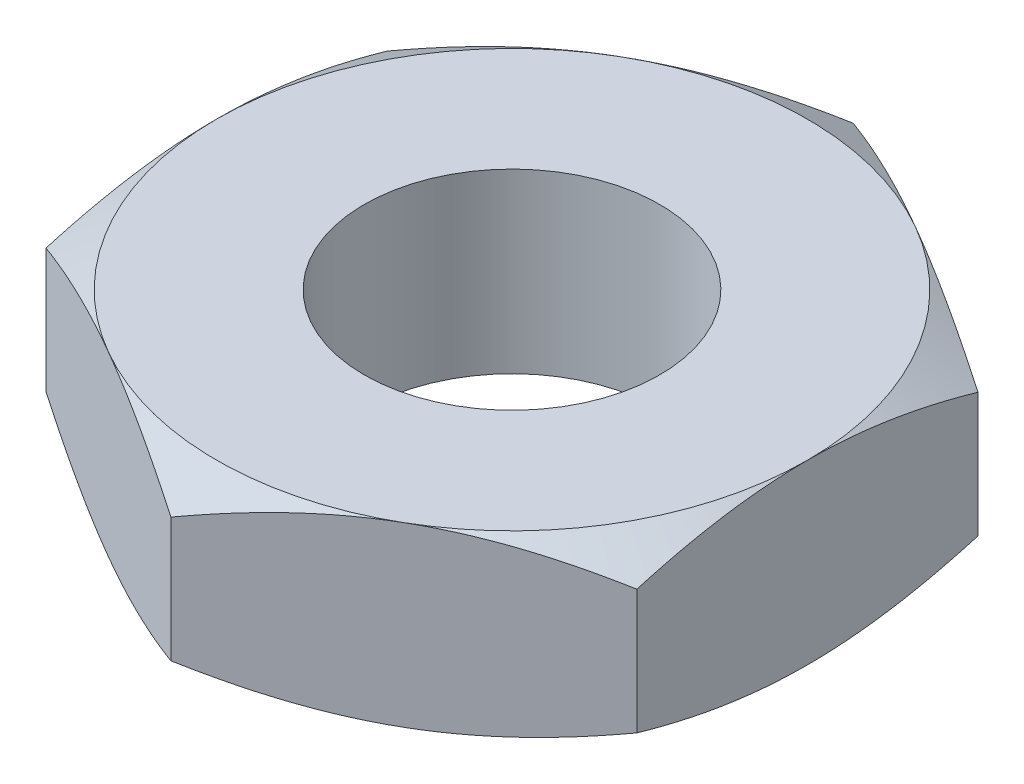
ISO-10303-21;
HEADER;
FILE_DESCRIPTION(('STEP AP214'),'2;1');
FILE_NAME('part.step','',(''),(''),'','','');
FILE_SCHEMA(('AUTOMOTIVE_DESIGN { 1 0 10303 214 1 1 1 1 }'));
ENDSEC;
DATA;
#1=APPLICATION_CONTEXT('core data for automotive mechanical design processes');
#2=APPLICATION_PROTOCOL_DEFINITION('international standard','automotive_design',2000,#1);
#3=PRODUCT_CONTEXT('',#1,'mechanical');
#4=PRODUCT('Part','Part','',(#3));
#5=PRODUCT_RELATED_PRODUCT_CATEGORY('part','',(#4));
#6=PRODUCT_DEFINITION_FORMATION('','',#4);
#7=PRODUCT_DEFINITION_CONTEXT('part definition',#1,'design');
#8=PRODUCT_DEFINITION('design','',#6,#7);
#9=PRODUCT_DEFINITION_SHAPE('','',#8);
#10=(LENGTH_UNIT() NAMED_UNIT(*) SI_UNIT(.MILLI.,.METRE.));
#11=(NAMED_UNIT(*) PLANE_ANGLE_UNIT() SI_UNIT($,.RADIAN.));
#12=(NAMED_UNIT(*) SI_UNIT($,.STERADIAN.) SOLID_ANGLE_UNIT());
#13=UNCERTAINTY_MEASURE_WITH_UNIT(LENGTH_MEASURE(1.E-05),#10,'distance_accuracy_value','');
#14=(GEOMETRIC_REPRESENTATION_CONTEXT(3) GLOBAL_UNCERTAINTY_ASSIGNED_CONTEXT((#13)) GLOBAL_UNIT_ASSIGNED_CONTEXT((#10,
#11,#12)) REPRESENTATION_CONTEXT('',''));
#15=CARTESIAN_POINT('',(0.,0.,0.));
#16=DIRECTION('',(0.,0.,1.));
#17=DIRECTION('',(1.,0.,0.));
#18=AXIS2_PLACEMENT_3D('',#15,#16,#17);
#19=CARTESIAN_POINT('',(-2.,0.6,-1.15470053837925));
#20=DIRECTION('',(0.,1.,0.));
#21=DIRECTION('',(0.,0.,1.));
#22=AXIS2_PLACEMENT_3D('',#19,#20,#21);
#23=PLANE('',#22);
#24=CARTESIAN_POINT('',(0.,0.6,0.));
#25=DIRECTION('',(0.,1.,0.));
#26=DIRECTION('',(0.,0.,1.));
#27=AXIS2_PLACEMENT_3D('',#24,#25,#26);
#28=CIRCLE('',#27,1.);
#29=CARTESIAN_POINT('',(0.,0.6,1.));
#30=VERTEX_POINT('',#29);
#31=EDGE_CURVE('E243',#30,#30,#28,.T.);
#32=ORIENTED_EDGE('',*,*,#31,.F.);
#33=EDGE_LOOP('',(#32));
#34=FACE_BOUND('',#33,.T.);
#35=CARTESIAN_POINT('',(0.,0.6,0.));
#36=DIRECTION('',(0.,1.,0.));
#37=DIRECTION('',(0.,0.,1.));
#38=AXIS2_PLACEMENT_3D('',#35,#36,#37);
#39=CIRCLE('',#38,2.);
#40=CARTESIAN_POINT('',(-1.,0.6,1.73205080756888));
#41=VERTEX_POINT('',#40);
#42=CARTESIAN_POINT('',(1.,0.6,1.73205080756888));
#43=VERTEX_POINT('',#42);
#44=EDGE_CURVE('E302',#41,#43,#39,.T.);
#45=ORIENTED_EDGE('',*,*,#44,.T.);
#46=CARTESIAN_POINT('',(2.,0.6,0.));
#47=VERTEX_POINT('',#46);
#48=EDGE_CURVE('E305',#43,#47,#39,.T.);
#49=ORIENTED_EDGE('',*,*,#48,.T.);
#50=CARTESIAN_POINT('',(1.,0.6,-1.73205080756888));
#51=VERTEX_POINT('',#50);
#52=EDGE_CURVE('E312',#47,#51,#39,.T.);
#53=ORIENTED_EDGE('',*,*,#52,.T.);
#54=CARTESIAN_POINT('',(-1.,0.6,-1.73205080756888));
#55=VERTEX_POINT('',#54);
#56=EDGE_CURVE('E316',#51,#55,#39,.T.);
#57=ORIENTED_EDGE('',*,*,#56,.T.);
#58=CARTESIAN_POINT('',(-2.,0.6,0.));
#59=VERTEX_POINT('',#58);
#60=EDGE_CURVE('E309',#55,#59,#39,.T.);
#61=ORIENTED_EDGE('',*,*,#60,.T.);
#62=EDGE_CURVE('E304',#59,#41,#39,.T.);
#63=ORIENTED_EDGE('',*,*,#62,.T.);
#64=EDGE_LOOP('',(#45,#49,#53,#57,#61,#63));
#65=FACE_BOUND('',#64,.T.);
#66=ADVANCED_FACE('F39',(#34,#65),#23,.T.);
#67=CARTESIAN_POINT('',(0.,0.6,-2.3094010767585));
#68=DIRECTION('',(0.5,0.,0.866025403784439));
#69=DIRECTION('',(0.866025403784439,0.,-0.5));
#70=AXIS2_PLACEMENT_3D('',#67,#68,#69);
#71=PLANE('',#70);
#72=DIRECTION('',(0.,-1.,0.));
#73=VECTOR('',#72,1.);
#74=CARTESIAN_POINT('',(0.,0.6,-2.3094010767585));
#75=LINE('',#74,#73);
#76=CARTESIAN_POINT('',(0.,0.421367205045919,-2.3094010767585));
#77=VERTEX_POINT('',#76);
#78=CARTESIAN_POINT('',(0.,-0.421367205045919,-2.3094010767585));
#79=VERTEX_POINT('',#78);
#80=EDGE_CURVE('E240',#77,#79,#75,.T.);
#81=ORIENTED_EDGE('',*,*,#80,.T.);
#82=CARTESIAN_POINT('',(0.000200000000000439,-0.421300533379502,-2.30951654681234));
#83=CARTESIAN_POINT('',(-0.0876912629000594,-0.450610463899321,-2.25877250251758));
#84=CARTESIAN_POINT('',(-0.176341194473591,-0.477267148019533,-2.20759044065996));
#85=CARTESIAN_POINT('',(-0.355176246997801,-0.523797508979279,-2.10433997494456));
#86=CARTESIAN_POINT('',(-0.445364546505036,-0.54365472361722,-2.05226973594631));
#87=CARTESIAN_POINT('',(-0.624623385763305,-0.574566535976747,-1.94877459684592));
#88=CARTESIAN_POINT('',(-0.713666338226303,-0.585826848401469,-1.89736562427197));
#89=CARTESIAN_POINT('',(-0.892171397785043,-0.599271337405358,-1.79430568008402));
#90=CARTESIAN_POINT('',(-0.981632855703958,-0.601466645046532,-1.74265508327244));
#91=CARTESIAN_POINT('',(-1.1488083535488,-0.596909010669351,-1.64613626458981));
#92=CARTESIAN_POINT('',(-1.22654737026578,-0.591275125312985,-1.60125362236173));
#93=CARTESIAN_POINT('',(-1.38151891453613,-0.573416104739172,-1.51178075956051));
#94=CARTESIAN_POINT('',(-1.4587509057412,-0.561184863976561,-1.46719084864821));
#95=CARTESIAN_POINT('',(-1.6140421864822,-0.53060656313239,-1.37753338590959));
#96=CARTESIAN_POINT('',(-1.69208181310738,-0.512129832934284,-1.33247718647009));
#97=CARTESIAN_POINT('',(-1.84699686569214,-0.470194481787144,-1.24303693915875));
#98=CARTESIAN_POINT('',(-1.92387427762312,-0.446745719507687,-1.1986517446858));
#99=CARTESIAN_POINT('',(-2.0002,-0.421300533379502,-1.15458506832541));
#100=B_SPLINE_CURVE_WITH_KNOTS('',3,(#82,#83,#84,#85,#86,#87,#88,#89,#90,#91,#92,#93,#94,#95,
#96,#97,#98,#99),.UNSPECIFIED.,.F.,.F.,(4,2,2,2,2,2,2,2,4),(0.,0.31703182469561,
0.634825876346563,0.944753967652636,1.25430138000371,1.52387047293094,1.79368946861028,
2.06949491027634,2.34475850821473),.UNSPECIFIED.);
#101=CARTESIAN_POINT('',(-1.,-0.6,-1.73205080756888));
#102=VERTEX_POINT('',#101);
#103=EDGE_CURVE('E62',#79,#102,#100,.T.);
#104=ORIENTED_EDGE('',*,*,#103,.T.);
#105=CARTESIAN_POINT('',(-2.,-0.421367205046049,-1.15470053837945));
#106=VERTEX_POINT('',#105);
#107=EDGE_CURVE('E198',#102,#106,#100,.T.);
#108=ORIENTED_EDGE('',*,*,#107,.T.);
#109=DIRECTION('',(0.,-1.,0.));
#110=VECTOR('',#109,1.);
#111=CARTESIAN_POINT('',(-2.,0.6,-1.15470053837925));
#112=LINE('',#111,#110);
#113=CARTESIAN_POINT('',(-2.,0.421367205046049,-1.15470053837945));
#114=VERTEX_POINT('',#113);
#115=EDGE_CURVE('E228',#114,#106,#112,.T.);
#116=ORIENTED_EDGE('',*,*,#115,.F.);
#117=CARTESIAN_POINT('',(0.000200000000000439,0.421300533379502,-2.30951654681234));
#118=CARTESIAN_POINT('',(-0.0876912629000594,0.450610463899321,-2.25877250251758));
#119=CARTESIAN_POINT('',(-0.176341194473591,0.477267148019533,-2.20759044065996));
#120=CARTESIAN_POINT('',(-0.355176246997801,0.523797508979279,-2.10433997494456));
#121=CARTESIAN_POINT('',(-0.445364546505036,0.54365472361722,-2.05226973594631));
#122=CARTESIAN_POINT('',(-0.624623385763305,0.574566535976747,-1.94877459684592));
#123=CARTESIAN_POINT('',(-0.713666338226303,0.585826848401469,-1.89736562427197));
#124=CARTESIAN_POINT('',(-0.892171397785043,0.599271337405358,-1.79430568008402));
#125=CARTESIAN_POINT('',(-0.981632855703958,0.601466645046532,-1.74265508327244));
#126=CARTESIAN_POINT('',(-1.1488083535488,0.596909010669351,-1.64613626458981));
#127=CARTESIAN_POINT('',(-1.22654737026578,0.591275125312985,-1.60125362236173));
#128=CARTESIAN_POINT('',(-1.38151891453613,0.573416104739172,-1.51178075956051));
#129=CARTESIAN_POINT('',(-1.4587509057412,0.561184863976561,-1.46719084864821));
#130=CARTESIAN_POINT('',(-1.6140421864822,0.53060656313239,-1.37753338590959));
#131=CARTESIAN_POINT('',(-1.69208181310738,0.512129832934284,-1.33247718647009));
#132=CARTESIAN_POINT('',(-1.84699686569214,0.470194481787144,-1.24303693915875));
#133=CARTESIAN_POINT('',(-1.92387427762312,0.446745719507687,-1.1986517446858));
#134=CARTESIAN_POINT('',(-2.0002,0.421300533379502,-1.15458506832541));
#135=B_SPLINE_CURVE_WITH_KNOTS('',3,(#117,#118,#119,#120,#121,#122,#123,#124,#125,#126,#127,
#128,#129,#130,#131,#132,#133,#134),.UNSPECIFIED.,.F.,.F.,(4,2,2,2,2,2,2,2,4),(0.,
0.31703182469561,0.634825876346563,0.944753967652636,1.25430138000371,1.52387047293094,
1.79368946861028,2.06949491027634,2.34475850821473),.UNSPECIFIED.);
#136=EDGE_CURVE('E250',#55,#114,#135,.T.);
#137=ORIENTED_EDGE('',*,*,#136,.F.);
#138=EDGE_CURVE('E247',#77,#55,#135,.T.);
#139=ORIENTED_EDGE('',*,*,#138,.F.);
#140=EDGE_LOOP('',(#81,#104,#108,#116,#137,#139));
#141=FACE_BOUND('',#140,.T.);
#142=ADVANCED_FACE('F41',(#141),#71,.F.);
#143=CARTESIAN_POINT('',(-2.,0.6,-1.15470053837925));
#144=DIRECTION('',(1.,0.,0.));
#145=DIRECTION('',(0.,0.,-1.));
#146=AXIS2_PLACEMENT_3D('',#143,#144,#145);
#147=PLANE('',#146);
#148=ORIENTED_EDGE('',*,*,#115,.T.);
#149=CARTESIAN_POINT('',(-2.,0.38557288901344,-3.12126753611571));
#150=CARTESIAN_POINT('',(-2.,0.343033819884847,-3.03373603253382));
#151=CARTESIAN_POINT('',(-2.,0.300897046350178,-2.94600566264244));
#152=CARTESIAN_POINT('',(-2.,0.217654002804882,-2.77004148551632));
#153=CARTESIAN_POINT('',(-2.,0.176547891526083,-2.68180760327354));
#154=CARTESIAN_POINT('',(-2.,0.0953895262527858,-2.50428557296446));
#155=CARTESIAN_POINT('',(-2.,0.0553440575414027,-2.41499431225501));
#156=CARTESIAN_POINT('',(-2.,-0.0231336996934489,-2.23570828641359));
#157=CARTESIAN_POINT('',(-2.,-0.0615660632000194,-2.14571355421277));
#158=CARTESIAN_POINT('',(-2.,-0.137618637341878,-1.9619137188298));
#159=CARTESIAN_POINT('',(-2.,-0.175170980395035,-1.86808038132573));
#160=CARTESIAN_POINT('',(-2.,-0.247473123064834,-1.67934204020328));
#161=CARTESIAN_POINT('',(-2.,-0.282223173005209,-1.58443713317158));
#162=CARTESIAN_POINT('',(-2.,-0.348034806312006,-1.39354791499266));
#163=CARTESIAN_POINT('',(-2.,-0.379103328069959,-1.29756601992183));
#164=CARTESIAN_POINT('',(-2.,-0.43656407784701,-1.10422565950118));
#165=CARTESIAN_POINT('',(-2.,-0.46295775755574,-1.00686763166145));
#166=CARTESIAN_POINT('',(-2.,-0.509676701821438,-0.811250894587943));
#167=CARTESIAN_POINT('',(-2.,-0.530034820909343,-0.713000178827866));
#168=CARTESIAN_POINT('',(-2.,-0.563542227148979,-0.51525761994497));
#169=CARTESIAN_POINT('',(-2.,-0.576692254149941,-0.415765905272652));
#170=CARTESIAN_POINT('',(-2.,-0.594559696893259,-0.217342464958799));
#171=CARTESIAN_POINT('',(-2.,-0.599387104142226,-0.118420932899998));
#172=CARTESIAN_POINT('',(-2.,-0.600503396452733,0.0794683361571467));
#173=CARTESIAN_POINT('',(-2.,-0.596792096656169,0.178436074109446));
#174=CARTESIAN_POINT('',(-2.,-0.578063778540289,0.414659658925583));
#175=CARTESIAN_POINT('',(-2.,-0.559162586891577,0.551609910573144));
#176=CARTESIAN_POINT('',(-2.,-0.508265075021401,0.823054674007726));
#177=CARTESIAN_POINT('',(-2.,-0.476256473923137,0.957546758850365));
#178=CARTESIAN_POINT('',(-2.,-0.401810126353593,1.22689179635191));
#179=CARTESIAN_POINT('',(-2.,-0.359148525475946,1.36168130483449));
#180=CARTESIAN_POINT('',(-2.,-0.28989757673053,1.56197975811112));
#181=CARTESIAN_POINT('',(-2.,-0.265939877951343,1.62842575511412));
#182=CARTESIAN_POINT('',(-2.,-0.216547213808057,1.76076659969631));
#183=CARTESIAN_POINT('',(-2.,-0.191112276924237,1.82666145787312));
#184=CARTESIAN_POINT('',(-2.,-0.123211373557019,1.99778681182454));
#185=CARTESIAN_POINT('',(-2.,-0.0797737383910382,2.10263074104482));
#186=CARTESIAN_POINT('',(-2.,0.00949834214268721,2.31129680003625));
#187=CARTESIAN_POINT('',(-2.,0.0553330034415304,2.41511883674791));
#188=CARTESIAN_POINT('',(-2.,0.148852476124769,2.62196120377702));
#189=CARTESIAN_POINT('',(-2.,0.196537840400779,2.72498128330376));
#190=CARTESIAN_POINT('',(-2.,0.29334179704414,2.93034706192578));
#191=CARTESIAN_POINT('',(-2.,0.342460428478685,3.03269274254529));
#192=CARTESIAN_POINT('',(-2.,0.49163439526772,3.33919760122935));
#193=CARTESIAN_POINT('',(-2.,0.593374943951518,3.54253566503882));
#194=CARTESIAN_POINT('',(-2.,0.79972473458573,3.94769403743467));
#195=CARTESIAN_POINT('',(-2.,0.904333459413751,4.14951461136634));
#196=CARTESIAN_POINT('',(-2.,1.10503354746327,4.5321025708419));
#197=CARTESIAN_POINT('',(-2.,1.20093777929948,4.71296829565948));
#198=CARTESIAN_POINT('',(-2.,1.39392970686111,5.07407845318899));
#199=CARTESIAN_POINT('',(-2.,1.49101746477198,5.25432285261106));
#200=CARTESIAN_POINT('',(-2.,1.68577789266207,5.61378039618828));
#201=CARTESIAN_POINT('',(-2.,1.78344785740034,5.79299500785806));
#202=CARTESIAN_POINT('',(-2.,1.97946951859646,6.15103475800708));
#203=CARTESIAN_POINT('',(-2.,2.07782116654584,6.329859923033));
#204=CARTESIAN_POINT('',(-2.,2.17642218980802,6.50854651302516));
#205=B_SPLINE_CURVE_WITH_KNOTS('',3,(#149,#150,#151,#152,#153,#154,#155,#156,#157,#158,#159,
#160,#161,#162,#163,#164,#165,#166,#167,#168,#169,#170,#171,#172,#173,#174,#175,#176,#177,#178,
#179,#180,#181,#182,#183,#184,#185,#186,#187,#188,#189,#190,#191,#192,#193,#194,#195,#196,#197,
#198,#199,#200,#201,#202,#203,#204),.UNSPECIFIED.,.F.,.F.,(4,2,2,2,2,2,2,2,2,2,2,2,2,2,2,2,2,2,
2,2,2,2,2,2,2,2,2,4),(0.,0.291965851079035,0.583976394873748,0.87754344183723,1.17109682757052,
1.47426835892393,1.77741277844896,2.07997647055767,2.3824460414974,2.68323754429508,
2.98399816762419,3.28075257631837,3.57751340963554,3.99140512508845,4.40568552342073,
4.82953678291614,5.04142455310282,5.2533082395735,5.59372400200991,5.9341704830902,
6.27471946641354,6.61527774091709,7.29734808574271,7.9792962539459,8.59344848602913,
9.20763312750973,9.81993507383114,10.4321938872487),.UNSPECIFIED.);
#206=CARTESIAN_POINT('',(-2.,-0.6,0.));
#207=VERTEX_POINT('',#206);
#208=EDGE_CURVE('E283',#106,#207,#205,.T.);
#209=ORIENTED_EDGE('',*,*,#208,.T.);
#210=CARTESIAN_POINT('',(-2.,-0.42136720504592,1.15470053837925));
#211=VERTEX_POINT('',#210);
#212=EDGE_CURVE('E277',#207,#211,#205,.T.);
#213=ORIENTED_EDGE('',*,*,#212,.T.);
#214=DIRECTION('',(0.,-1.,0.));
#215=VECTOR('',#214,1.);
#216=CARTESIAN_POINT('',(-2.,0.6,1.15470053837925));
#217=LINE('',#216,#215);
#218=CARTESIAN_POINT('',(-2.,0.42136720504592,1.15470053837925));
#219=VERTEX_POINT('',#218);
#220=EDGE_CURVE('E231',#219,#211,#217,.T.);
#221=ORIENTED_EDGE('',*,*,#220,.F.);
#222=CARTESIAN_POINT('',(-2.,-0.38557288901344,-3.12126753611571));
#223=CARTESIAN_POINT('',(-2.,-0.343033819884847,-3.03373603253382));
#224=CARTESIAN_POINT('',(-2.,-0.300897046350178,-2.94600566264244));
#225=CARTESIAN_POINT('',(-2.,-0.217654002804882,-2.77004148551632));
#226=CARTESIAN_POINT('',(-2.,-0.176547891526083,-2.68180760327354));
#227=CARTESIAN_POINT('',(-2.,-0.0953895262527858,-2.50428557296446));
#228=CARTESIAN_POINT('',(-2.,-0.0553440575414027,-2.41499431225501));
#229=CARTESIAN_POINT('',(-2.,0.0231336996934489,-2.23570828641359));
#230=CARTESIAN_POINT('',(-2.,0.0615660632000194,-2.14571355421277));
#231=CARTESIAN_POINT('',(-2.,0.137618637341878,-1.9619137188298));
#232=CARTESIAN_POINT('',(-2.,0.175170980395035,-1.86808038132573));
#233=CARTESIAN_POINT('',(-2.,0.247473123064834,-1.67934204020328));
#234=CARTESIAN_POINT('',(-2.,0.282223173005209,-1.58443713317158));
#235=CARTESIAN_POINT('',(-2.,0.348034806312006,-1.39354791499266));
#236=CARTESIAN_POINT('',(-2.,0.379103328069959,-1.29756601992183));
#237=CARTESIAN_POINT('',(-2.,0.43656407784701,-1.10422565950118));
#238=CARTESIAN_POINT('',(-2.,0.46295775755574,-1.00686763166145));
#239=CARTESIAN_POINT('',(-2.,0.509676701821438,-0.811250894587943));
#240=CARTESIAN_POINT('',(-2.,0.530034820909343,-0.713000178827866));
#241=CARTESIAN_POINT('',(-2.,0.563542227148979,-0.51525761994497));
#242=CARTESIAN_POINT('',(-2.,0.576692254149941,-0.415765905272652));
#243=CARTESIAN_POINT('',(-2.,0.594559696893259,-0.217342464958799));
#244=CARTESIAN_POINT('',(-2.,0.599387104142226,-0.118420932899998));
#245=CARTESIAN_POINT('',(-2.,0.600503396452733,0.0794683361571467));
#246=CARTESIAN_POINT('',(-2.,0.596792096656169,0.178436074109446));
#247=CARTESIAN_POINT('',(-2.,0.578063778540289,0.414659658925583));
#248=CARTESIAN_POINT('',(-2.,0.559162586891577,0.551609910573144));
#249=CARTESIAN_POINT('',(-2.,0.508265075021401,0.823054674007726));
#250=CARTESIAN_POINT('',(-2.,0.476256473923137,0.957546758850365));
#251=CARTESIAN_POINT('',(-2.,0.401810126353593,1.22689179635191));
#252=CARTESIAN_POINT('',(-2.,0.359148525475946,1.36168130483449));
#253=CARTESIAN_POINT('',(-2.,0.28989757673053,1.56197975811112));
#254=CARTESIAN_POINT('',(-2.,0.265939877951343,1.62842575511412));
#255=CARTESIAN_POINT('',(-2.,0.216547213808057,1.76076659969631));
#256=CARTESIAN_POINT('',(-2.,0.191112276924237,1.82666145787312));
#257=CARTESIAN_POINT('',(-2.,0.123211373557019,1.99778681182454));
#258=CARTESIAN_POINT('',(-2.,0.0797737383910382,2.10263074104482));
#259=CARTESIAN_POINT('',(-2.,-0.00949834214268721,2.31129680003625));
#260=CARTESIAN_POINT('',(-2.,-0.0553330034415304,2.41511883674791));
#261=CARTESIAN_POINT('',(-2.,-0.148852476124769,2.62196120377702));
#262=CARTESIAN_POINT('',(-2.,-0.196537840400779,2.72498128330376));
#263=CARTESIAN_POINT('',(-2.,-0.29334179704414,2.93034706192578));
#264=CARTESIAN_POINT('',(-2.,-0.342460428478685,3.03269274254529));
#265=CARTESIAN_POINT('',(-2.,-0.49163439526772,3.33919760122935));
#266=CARTESIAN_POINT('',(-2.,-0.593374943951518,3.54253566503882));
#267=CARTESIAN_POINT('',(-2.,-0.79972473458573,3.94769403743467));
#268=CARTESIAN_POINT('',(-2.,-0.904333459413751,4.14951461136634));
#269=CARTESIAN_POINT('',(-2.,-1.10503354746327,4.5321025708419));
#270=CARTESIAN_POINT('',(-2.,-1.20093777929948,4.71296829565948));
#271=CARTESIAN_POINT('',(-2.,-1.39392970686111,5.07407845318899));
#272=CARTESIAN_POINT('',(-2.,-1.49101746477198,5.25432285261106));
#273=CARTESIAN_POINT('',(-2.,-1.68577789266207,5.61378039618828));
#274=CARTESIAN_POINT('',(-2.,-1.78344785740034,5.79299500785806));
#275=CARTESIAN_POINT('',(-2.,-1.97946951859646,6.15103475800708));
#276=CARTESIAN_POINT('',(-2.,-2.07782116654584,6.329859923033));
#277=CARTESIAN_POINT('',(-2.,-2.17642218980802,6.50854651302516));
#278=B_SPLINE_CURVE_WITH_KNOTS('',3,(#222,#223,#224,#225,#226,#227,#228,#229,#230,#231,#232,
#233,#234,#235,#236,#237,#238,#239,#240,#241,#242,#243,#244,#245,#246,#247,#248,#249,#250,#251,
#252,#253,#254,#255,#256,#257,#258,#259,#260,#261,#262,#263,#264,#265,#266,#267,#268,#269,#270,
#271,#272,#273,#274,#275,#276,#277),.UNSPECIFIED.,.F.,.F.,(4,2,2,2,2,2,2,2,2,2,2,2,2,2,2,2,2,2,
2,2,2,2,2,2,2,2,2,4),(0.,0.291965851079035,0.583976394873748,0.87754344183723,1.17109682757052,
1.47426835892393,1.77741277844896,2.07997647055767,2.3824460414974,2.68323754429508,
2.98399816762419,3.28075257631837,3.57751340963554,3.99140512508845,4.40568552342073,
4.82953678291614,5.04142455310282,5.2533082395735,5.59372400200991,5.9341704830902,
6.27471946641354,6.61527774091709,7.29734808574271,7.9792962539459,8.59344848602913,
9.20763312750973,9.81993507383114,10.4321938872487),.UNSPECIFIED.);
#279=EDGE_CURVE('E257',#59,#219,#278,.T.);
#280=ORIENTED_EDGE('',*,*,#279,.F.);
#281=EDGE_CURVE('E256',#114,#59,#278,.T.);
#282=ORIENTED_EDGE('',*,*,#281,.F.);
#283=EDGE_LOOP('',(#148,#209,#213,#221,#280,#282));
#284=FACE_BOUND('',#283,.T.);
#285=ADVANCED_FACE('F270',(#284),#147,.F.);
#286=CARTESIAN_POINT('',(-2.,0.6,1.15470053837925));
#287=DIRECTION('',(0.5,0.,-0.866025403784438));
#288=DIRECTION('',(-0.866025403784438,0.,-0.5));
#289=AXIS2_PLACEMENT_3D('',#286,#287,#288);
#290=PLANE('',#289);
#291=ORIENTED_EDGE('',*,*,#220,.T.);
#292=CARTESIAN_POINT('',(-2.0002,-0.421300533379503,1.15458506832541));
#293=CARTESIAN_POINT('',(-1.91230873709994,-0.450610463899322,1.20532911262018));
#294=CARTESIAN_POINT('',(-1.82365880552641,-0.477267148019534,1.2565111744778));
#295=CARTESIAN_POINT('',(-1.6448237530022,-0.523797508979279,1.35976164019319));
#296=CARTESIAN_POINT('',(-1.55463545349496,-0.543654723617221,1.41183187919145));
#297=CARTESIAN_POINT('',(-1.37537661423669,-0.574566535976748,1.51532701829183));
#298=CARTESIAN_POINT('',(-1.2863336617737,-0.585826848401469,1.56673599086578));
#299=CARTESIAN_POINT('',(-1.10782860221496,-0.599271337405358,1.66979593505373));
#300=CARTESIAN_POINT('',(-1.01836714429604,-0.601466645046532,1.72144653186531));
#301=CARTESIAN_POINT('',(-0.851191646451203,-0.596909010669351,1.81796535054794));
#302=CARTESIAN_POINT('',(-0.773452629734217,-0.591275125312986,1.86284799277603));
#303=CARTESIAN_POINT('',(-0.618481085463867,-0.573416104739172,1.95232085557725));
#304=CARTESIAN_POINT('',(-0.541249094258802,-0.561184863976561,1.99691076648954));
#305=CARTESIAN_POINT('',(-0.3859578135178,-0.53060656313239,2.08656822922816));
#306=CARTESIAN_POINT('',(-0.307918186892621,-0.512129832934284,2.13162442866767));
#307=CARTESIAN_POINT('',(-0.153003134307866,-0.470194481787144,2.221064675979));
#308=CARTESIAN_POINT('',(-0.0761257223768801,-0.446745719507687,2.26544987045196));
#309=CARTESIAN_POINT('',(0.000200000000000204,-0.421300533379503,2.30951654681234));
#310=B_SPLINE_CURVE_WITH_KNOTS('',3,(#292,#293,#294,#295,#296,#297,#298,#299,#300,#301,#302,
#303,#304,#305,#306,#307,#308,#309),.UNSPECIFIED.,.F.,.F.,(4,2,2,2,2,2,2,2,4),(0.,
0.31703182469561,0.634825876346563,0.944753967652635,1.25430138000371,1.52387047293094,
1.79368946861028,2.06949491027634,2.34475850821472),.UNSPECIFIED.);
#311=CARTESIAN_POINT('',(-1.,-0.6,1.73205080756888));
#312=VERTEX_POINT('',#311);
#313=EDGE_CURVE('E163',#211,#312,#310,.T.);
#314=ORIENTED_EDGE('',*,*,#313,.T.);
#315=CARTESIAN_POINT('',(0.,-0.421367205045919,2.3094010767585));
#316=VERTEX_POINT('',#315);
#317=EDGE_CURVE('E147',#312,#316,#310,.T.);
#318=ORIENTED_EDGE('',*,*,#317,.T.);
#319=DIRECTION('',(0.,-1.,0.));
#320=VECTOR('',#319,1.);
#321=CARTESIAN_POINT('',(0.,0.6,2.3094010767585));
#322=LINE('',#321,#320);
#323=CARTESIAN_POINT('',(0.,0.421367205045919,2.3094010767585));
#324=VERTEX_POINT('',#323);
#325=EDGE_CURVE('E162',#324,#316,#322,.T.);
#326=ORIENTED_EDGE('',*,*,#325,.F.);
#327=CARTESIAN_POINT('',(-2.0002,0.421300533379503,1.15458506832541));
#328=CARTESIAN_POINT('',(-1.91230873709994,0.450610463899322,1.20532911262018));
#329=CARTESIAN_POINT('',(-1.82365880552641,0.477267148019534,1.2565111744778));
#330=CARTESIAN_POINT('',(-1.6448237530022,0.523797508979279,1.35976164019319));
#331=CARTESIAN_POINT('',(-1.55463545349496,0.543654723617221,1.41183187919145));
#332=CARTESIAN_POINT('',(-1.37537661423669,0.574566535976748,1.51532701829183));
#333=CARTESIAN_POINT('',(-1.2863336617737,0.585826848401469,1.56673599086578));
#334=CARTESIAN_POINT('',(-1.10782860221496,0.599271337405358,1.66979593505373));
#335=CARTESIAN_POINT('',(-1.01836714429604,0.601466645046532,1.72144653186531));
#336=CARTESIAN_POINT('',(-0.851191646451203,0.596909010669351,1.81796535054794));
#337=CARTESIAN_POINT('',(-0.773452629734217,0.591275125312986,1.86284799277603));
#338=CARTESIAN_POINT('',(-0.618481085463867,0.573416104739172,1.95232085557725));
#339=CARTESIAN_POINT('',(-0.541249094258802,0.561184863976561,1.99691076648954));
#340=CARTESIAN_POINT('',(-0.3859578135178,0.53060656313239,2.08656822922816));
#341=CARTESIAN_POINT('',(-0.307918186892621,0.512129832934284,2.13162442866767));
#342=CARTESIAN_POINT('',(-0.153003134307866,0.470194481787144,2.221064675979));
#343=CARTESIAN_POINT('',(-0.0761257223768801,0.446745719507687,2.26544987045196));
#344=CARTESIAN_POINT('',(0.000200000000000204,0.421300533379503,2.30951654681234));
#345=B_SPLINE_CURVE_WITH_KNOTS('',3,(#327,#328,#329,#330,#331,#332,#333,#334,#335,#336,#337,
#338,#339,#340,#341,#342,#343,#344),.UNSPECIFIED.,.F.,.F.,(4,2,2,2,2,2,2,2,4),(0.,
0.31703182469561,0.634825876346563,0.944753967652635,1.25430138000371,1.52387047293094,
1.79368946861028,2.06949491027634,2.34475850821472),.UNSPECIFIED.);
#346=EDGE_CURVE('E264',#41,#324,#345,.T.);
#347=ORIENTED_EDGE('',*,*,#346,.F.);
#348=EDGE_CURVE('E263',#219,#41,#345,.T.);
#349=ORIENTED_EDGE('',*,*,#348,.F.);
#350=EDGE_LOOP('',(#291,#314,#318,#326,#347,#349));
#351=FACE_BOUND('',#350,.T.);
#352=ADVANCED_FACE('F273',(#351),#290,.F.);
#353=CARTESIAN_POINT('',(0.,0.6,2.3094010767585));
#354=DIRECTION('',(-0.5,0.,-0.866025403784438));
#355=DIRECTION('',(-0.866025403784439,0.,0.5));
#356=AXIS2_PLACEMENT_3D('',#353,#354,#355);
#357=PLANE('',#356);
#358=ORIENTED_EDGE('',*,*,#325,.T.);
#359=CARTESIAN_POINT('',(-0.000200000000000079,-0.421300533379503,2.30951654681234));
#360=CARTESIAN_POINT('',(0.0876912629000598,-0.450610463899322,2.25877250251758));
#361=CARTESIAN_POINT('',(0.176341194473591,-0.477267148019534,2.20759044065995));
#362=CARTESIAN_POINT('',(0.355176246997802,-0.523797508979279,2.10433997494456));
#363=CARTESIAN_POINT('',(0.445364546505036,-0.543654723617221,2.0522697359463));
#364=CARTESIAN_POINT('',(0.624623385763306,-0.574566535976748,1.94877459684592));
#365=CARTESIAN_POINT('',(0.713666338226304,-0.585826848401469,1.89736562427197));
#366=CARTESIAN_POINT('',(0.892171397785043,-0.599271337405358,1.79430568008402));
#367=CARTESIAN_POINT('',(0.981632855703958,-0.601466645046532,1.74265508327244));
#368=CARTESIAN_POINT('',(1.1488083535488,-0.596909010669351,1.64613626458981));
#369=CARTESIAN_POINT('',(1.22654737026578,-0.591275125312986,1.60125362236173));
#370=CARTESIAN_POINT('',(1.38151891453613,-0.573416104739172,1.51178075956051));
#371=CARTESIAN_POINT('',(1.4587509057412,-0.561184863976561,1.46719084864821));
#372=CARTESIAN_POINT('',(1.6140421864822,-0.530606563132391,1.37753338590959));
#373=CARTESIAN_POINT('',(1.69208181310738,-0.512129832934285,1.33247718647009));
#374=CARTESIAN_POINT('',(1.84699686569213,-0.470194481787145,1.24303693915875));
#375=CARTESIAN_POINT('',(1.92387427762312,-0.446745719507687,1.1986517446858));
#376=CARTESIAN_POINT('',(2.0002,-0.421300533379503,1.15458506832541));
#377=B_SPLINE_CURVE_WITH_KNOTS('',3,(#359,#360,#361,#362,#363,#364,#365,#366,#367,#368,#369,
#370,#371,#372,#373,#374,#375,#376),.UNSPECIFIED.,.F.,.F.,(4,2,2,2,2,2,2,2,4),(0.,
0.31703182469561,0.634825876346563,0.944753967652636,1.25430138000371,1.52387047293094,
1.79368946861028,2.06949491027634,2.34475850821472),.UNSPECIFIED.);
#378=CARTESIAN_POINT('',(1.,-0.6,1.73205080756888));
#379=VERTEX_POINT('',#378);
#380=EDGE_CURVE('E141',#316,#379,#377,.T.);
#381=ORIENTED_EDGE('',*,*,#380,.T.);
#382=CARTESIAN_POINT('',(2.,-0.42136720504592,1.15470053837925));
#383=VERTEX_POINT('',#382);
#384=EDGE_CURVE('E129',#379,#383,#377,.T.);
#385=ORIENTED_EDGE('',*,*,#384,.T.);
#386=DIRECTION('',(0.,-1.,0.));
#387=VECTOR('',#386,1.);
#388=CARTESIAN_POINT('',(2.,0.6,1.15470053837925));
#389=LINE('',#388,#387);
#390=CARTESIAN_POINT('',(2.,0.42136720504592,1.15470053837925));
#391=VERTEX_POINT('',#390);
#392=EDGE_CURVE('E235',#391,#383,#389,.T.);
#393=ORIENTED_EDGE('',*,*,#392,.F.);
#394=CARTESIAN_POINT('',(-0.000200000000000079,0.421300533379503,2.30951654681234));
#395=CARTESIAN_POINT('',(0.0876912629000598,0.450610463899322,2.25877250251758));
#396=CARTESIAN_POINT('',(0.176341194473591,0.477267148019534,2.20759044065995));
#397=CARTESIAN_POINT('',(0.355176246997802,0.523797508979279,2.10433997494456));
#398=CARTESIAN_POINT('',(0.445364546505036,0.543654723617221,2.0522697359463));
#399=CARTESIAN_POINT('',(0.624623385763306,0.574566535976748,1.94877459684592));
#400=CARTESIAN_POINT('',(0.713666338226304,0.585826848401469,1.89736562427197));
#401=CARTESIAN_POINT('',(0.892171397785043,0.599271337405358,1.79430568008402));
#402=CARTESIAN_POINT('',(0.981632855703958,0.601466645046532,1.74265508327244));
#403=CARTESIAN_POINT('',(1.1488083535488,0.596909010669351,1.64613626458981));
#404=CARTESIAN_POINT('',(1.22654737026578,0.591275125312986,1.60125362236173));
#405=CARTESIAN_POINT('',(1.38151891453613,0.573416104739172,1.51178075956051));
#406=CARTESIAN_POINT('',(1.4587509057412,0.561184863976561,1.46719084864821));
#407=CARTESIAN_POINT('',(1.6140421864822,0.530606563132391,1.37753338590959));
#408=CARTESIAN_POINT('',(1.69208181310738,0.512129832934285,1.33247718647009));
#409=CARTESIAN_POINT('',(1.84699686569213,0.470194481787145,1.24303693915875));
#410=CARTESIAN_POINT('',(1.92387427762312,0.446745719507687,1.1986517446858));
#411=CARTESIAN_POINT('',(2.0002,0.421300533379503,1.15458506832541));
#412=B_SPLINE_CURVE_WITH_KNOTS('',3,(#394,#395,#396,#397,#398,#399,#400,#401,#402,#403,#404,
#405,#406,#407,#408,#409,#410,#411),.UNSPECIFIED.,.F.,.F.,(4,2,2,2,2,2,2,2,4),(0.,
0.31703182469561,0.634825876346563,0.944753967652636,1.25430138000371,1.52387047293094,
1.79368946861028,2.06949491027634,2.34475850821472),.UNSPECIFIED.);
#413=EDGE_CURVE('E334',#43,#391,#412,.T.);
#414=ORIENTED_EDGE('',*,*,#413,.F.);
#415=EDGE_CURVE('E336',#324,#43,#412,.T.);
#416=ORIENTED_EDGE('',*,*,#415,.F.);
#417=EDGE_LOOP('',(#358,#381,#385,#393,#414,#416));
#418=FACE_BOUND('',#417,.T.);
#419=ADVANCED_FACE('F159',(#418),#357,.F.);
#420=CARTESIAN_POINT('',(2.,0.6,1.15470053837925));
#421=DIRECTION('',(-1.,0.,0.));
#422=DIRECTION('',(0.,0.,1.));
#423=AXIS2_PLACEMENT_3D('',#420,#421,#422);
#424=PLANE('',#423);
#425=ORIENTED_EDGE('',*,*,#392,.T.);
#426=CARTESIAN_POINT('',(2.,0.385572888836607,-3.12126753575195));
#427=CARTESIAN_POINT('',(2.,0.343033819715403,-3.03373603218229));
#428=CARTESIAN_POINT('',(2.,0.30089704618812,-2.94600566230316));
#429=CARTESIAN_POINT('',(2.,0.217654002657559,-2.77004148520157));
#430=CARTESIAN_POINT('',(2.,0.176547891386109,-2.68180760297106));
#431=CARTESIAN_POINT('',(2.,0.0953895261275171,-2.50428557268674));
#432=CARTESIAN_POINT('',(2.,0.0553440574234876,-2.41499431198977));
#433=CARTESIAN_POINT('',(2.,-0.0231336997967796,-2.23570828617338));
#434=CARTESIAN_POINT('',(2.,-0.0615660632961192,-2.14571355398512));
#435=CARTESIAN_POINT('',(2.,-0.137618637423321,-1.96191371862823));
#436=CARTESIAN_POINT('',(2.,-0.175170980469069,-1.86808038113767));
#437=CARTESIAN_POINT('',(2.,-0.247473123124449,-1.67934204004246));
#438=CARTESIAN_POINT('',(2.,-0.282223173057816,-1.58443713302449));
#439=CARTESIAN_POINT('',(2.,-0.348034806351269,-1.39354791487329));
#440=CARTESIAN_POINT('',(2.,-0.379103328102884,-1.29756601981645));
#441=CARTESIAN_POINT('',(2.,-0.4365640778683,-1.10422565942415));
#442=CARTESIAN_POINT('',(2.,-0.462957757571732,-1.00686763159879));
#443=CARTESIAN_POINT('',(2.,-0.509676701826748,-0.811250894561444));
#444=CARTESIAN_POINT('',(2.,-0.530034820909683,-0.713000178823259));
#445=CARTESIAN_POINT('',(2.,-0.563542227142693,-0.515257619984673));
#446=CARTESIAN_POINT('',(2.,-0.576692254141994,-0.415765905334769));
#447=CARTESIAN_POINT('',(2.,-0.594559696885982,-0.217342465065374));
#448=CARTESIAN_POINT('',(2.,-0.599387104137207,-0.118420933028612));
#449=CARTESIAN_POINT('',(2.,-0.600503396456062,0.0794683359848014));
#450=CARTESIAN_POINT('',(2.,-0.596792096665589,0.178436073915408));
#451=CARTESIAN_POINT('',(2.,-0.578063778566608,0.414659658698199));
#452=CARTESIAN_POINT('',(2.,-0.559162586928115,0.551609910334313));
#453=CARTESIAN_POINT('',(2.,-0.508265075078632,0.823054673746852));
#454=CARTESIAN_POINT('',(2.,-0.476256473990844,0.957546758578897));
#455=CARTESIAN_POINT('',(2.,-0.401810126442022,1.22689179605915));
#456=CARTESIAN_POINT('',(2.,-0.359148525574628,1.36168130453104));
#457=CARTESIAN_POINT('',(2.,-0.289897576844064,1.56197975779171));
#458=CARTESIAN_POINT('',(2.,-0.265939878069735,1.62842575478941));
#459=CARTESIAN_POINT('',(2.,-0.216547213936003,1.760766599361));
#460=CARTESIAN_POINT('',(2.,-0.191112277056877,1.82666145753252));
#461=CARTESIAN_POINT('',(2.,-0.123211373697485,1.99778681148072));
#462=CARTESIAN_POINT('',(2.,-0.0797737385341961,2.10263074070294));
#463=CARTESIAN_POINT('',(2.,0.00949834199488829,2.31129679969803));
#464=CARTESIAN_POINT('',(2.,0.0553330032917826,2.41511883641139));
#465=CARTESIAN_POINT('',(2.,0.148852475971668,2.62196120344372));
#466=CARTESIAN_POINT('',(2.,0.196537840246275,2.72498128297198));
#467=CARTESIAN_POINT('',(2.,0.293341796887225,2.93034706159688));
#468=CARTESIAN_POINT('',(2.,0.342460428320762,3.03269274221776));
#469=CARTESIAN_POINT('',(2.,0.491634395107272,3.33919760090586));
#470=CARTESIAN_POINT('',(2.,0.593374943789992,3.54253566471783));
#471=CARTESIAN_POINT('',(2.,0.799724734422688,3.94769403711835));
#472=CARTESIAN_POINT('',(2.,0.904333459250272,4.14951461105218));
#473=CARTESIAN_POINT('',(2.,1.10503354729843,4.53210257052994));
#474=CARTESIAN_POINT('',(2.,1.20093777913366,4.71296829534756));
#475=CARTESIAN_POINT('',(2.,1.39392970669353,5.07407845287707));
#476=CARTESIAN_POINT('',(2.,1.49101746460362,5.2543228522991));
#477=CARTESIAN_POINT('',(2.,1.68577789249214,5.61378039587587));
#478=CARTESIAN_POINT('',(2.,1.7834478572296,5.79299500754524));
#479=CARTESIAN_POINT('',(2.,1.97946951842421,6.1510347576934));
#480=CARTESIAN_POINT('',(2.,2.07782116637289,6.32985992271886));
#481=CARTESIAN_POINT('',(2.,2.17642218963439,6.50854651271054));
#482=B_SPLINE_CURVE_WITH_KNOTS('',3,(#426,#427,#428,#429,#430,#431,#432,#433,#434,#435,#436,
#437,#438,#439,#440,#441,#442,#443,#444,#445,#446,#447,#448,#449,#450,#451,#452,#453,#454,#455,
#456,#457,#458,#459,#460,#461,#462,#463,#464,#465,#466,#467,#468,#469,#470,#471,#472,#473,#474,
#475,#476,#477,#478,#479,#480,#481),.UNSPECIFIED.,.F.,.F.,(4,2,2,2,2,2,2,2,2,2,2,2,2,2,2,2,2,2,
2,2,2,2,2,2,2,2,2,4),(0.,0.291965851036328,0.583976394788328,0.877543441708637,1.17109682739876,
1.47426835870626,1.7774127781854,2.07997647024836,2.38244604114237,2.68323754387286,
2.98399816713487,3.28075257576361,3.57751340901528,3.99140512443003,4.40568552272406,
4.82953678217955,5.04142455234632,5.2533082387971,5.59372400123578,5.93417048231838,
6.27471946564408,6.61527774015,7.29734808498085,7.97929625318921,8.59344848527119,
9.20763312675055,9.81993507306975,10.4321938864851),.UNSPECIFIED.);
#483=CARTESIAN_POINT('',(2.,-0.6,0.));
#484=VERTEX_POINT('',#483);
#485=EDGE_CURVE('E136',#383,#484,#482,.F.);
#486=ORIENTED_EDGE('',*,*,#485,.T.);
#487=CARTESIAN_POINT('',(2.,-0.42136720504592,-1.15470053837925));
#488=VERTEX_POINT('',#487);
#489=EDGE_CURVE('E172',#484,#488,#482,.F.);
#490=ORIENTED_EDGE('',*,*,#489,.T.);
#491=DIRECTION('',(0.,-1.,0.));
#492=VECTOR('',#491,1.);
#493=CARTESIAN_POINT('',(2.,0.6,-1.15470053837925));
#494=LINE('',#493,#492);
#495=CARTESIAN_POINT('',(2.,0.42136720504592,-1.15470053837925));
#496=VERTEX_POINT('',#495);
#497=EDGE_CURVE('E237',#496,#488,#494,.T.);
#498=ORIENTED_EDGE('',*,*,#497,.F.);
#499=CARTESIAN_POINT('',(2.,-0.385572888836607,-3.12126753575195));
#500=CARTESIAN_POINT('',(2.,-0.343033819715403,-3.03373603218229));
#501=CARTESIAN_POINT('',(2.,-0.30089704618812,-2.94600566230316));
#502=CARTESIAN_POINT('',(2.,-0.217654002657559,-2.77004148520157));
#503=CARTESIAN_POINT('',(2.,-0.176547891386109,-2.68180760297106));
#504=CARTESIAN_POINT('',(2.,-0.0953895261275171,-2.50428557268674));
#505=CARTESIAN_POINT('',(2.,-0.0553440574234876,-2.41499431198977));
#506=CARTESIAN_POINT('',(2.,0.0231336997967796,-2.23570828617338));
#507=CARTESIAN_POINT('',(2.,0.0615660632961192,-2.14571355398512));
#508=CARTESIAN_POINT('',(2.,0.137618637423321,-1.96191371862823));
#509=CARTESIAN_POINT('',(2.,0.175170980469069,-1.86808038113767));
#510=CARTESIAN_POINT('',(2.,0.247473123124449,-1.67934204004246));
#511=CARTESIAN_POINT('',(2.,0.282223173057816,-1.58443713302449));
#512=CARTESIAN_POINT('',(2.,0.348034806351269,-1.39354791487329));
#513=CARTESIAN_POINT('',(2.,0.379103328102884,-1.29756601981645));
#514=CARTESIAN_POINT('',(2.,0.4365640778683,-1.10422565942415));
#515=CARTESIAN_POINT('',(2.,0.462957757571732,-1.00686763159879));
#516=CARTESIAN_POINT('',(2.,0.509676701826748,-0.811250894561444));
#517=CARTESIAN_POINT('',(2.,0.530034820909683,-0.713000178823259));
#518=CARTESIAN_POINT('',(2.,0.563542227142693,-0.515257619984673));
#519=CARTESIAN_POINT('',(2.,0.576692254141994,-0.415765905334769));
#520=CARTESIAN_POINT('',(2.,0.594559696885982,-0.217342465065374));
#521=CARTESIAN_POINT('',(2.,0.599387104137207,-0.118420933028612));
#522=CARTESIAN_POINT('',(2.,0.600503396456062,0.0794683359848014));
#523=CARTESIAN_POINT('',(2.,0.596792096665589,0.178436073915408));
#524=CARTESIAN_POINT('',(2.,0.578063778566608,0.414659658698199));
#525=CARTESIAN_POINT('',(2.,0.559162586928115,0.551609910334313));
#526=CARTESIAN_POINT('',(2.,0.508265075078632,0.823054673746852));
#527=CARTESIAN_POINT('',(2.,0.476256473990844,0.957546758578897));
#528=CARTESIAN_POINT('',(2.,0.401810126442022,1.22689179605915));
#529=CARTESIAN_POINT('',(2.,0.359148525574628,1.36168130453104));
#530=CARTESIAN_POINT('',(2.,0.289897576844064,1.56197975779171));
#531=CARTESIAN_POINT('',(2.,0.265939878069735,1.62842575478941));
#532=CARTESIAN_POINT('',(2.,0.216547213936003,1.760766599361));
#533=CARTESIAN_POINT('',(2.,0.191112277056877,1.82666145753252));
#534=CARTESIAN_POINT('',(2.,0.123211373697485,1.99778681148072));
#535=CARTESIAN_POINT('',(2.,0.0797737385341961,2.10263074070294));
#536=CARTESIAN_POINT('',(2.,-0.00949834199488829,2.31129679969803));
#537=CARTESIAN_POINT('',(2.,-0.0553330032917826,2.41511883641139));
#538=CARTESIAN_POINT('',(2.,-0.148852475971668,2.62196120344372));
#539=CARTESIAN_POINT('',(2.,-0.196537840246275,2.72498128297198));
#540=CARTESIAN_POINT('',(2.,-0.293341796887225,2.93034706159688));
#541=CARTESIAN_POINT('',(2.,-0.342460428320762,3.03269274221776));
#542=CARTESIAN_POINT('',(2.,-0.491634395107272,3.33919760090586));
#543=CARTESIAN_POINT('',(2.,-0.593374943789992,3.54253566471783));
#544=CARTESIAN_POINT('',(2.,-0.799724734422688,3.94769403711835));
#545=CARTESIAN_POINT('',(2.,-0.904333459250272,4.14951461105218));
#546=CARTESIAN_POINT('',(2.,-1.10503354729843,4.53210257052994));
#547=CARTESIAN_POINT('',(2.,-1.20093777913366,4.71296829534756));
#548=CARTESIAN_POINT('',(2.,-1.39392970669353,5.07407845287707));
#549=CARTESIAN_POINT('',(2.,-1.49101746460362,5.2543228522991));
#550=CARTESIAN_POINT('',(2.,-1.68577789249214,5.61378039587587));
#551=CARTESIAN_POINT('',(2.,-1.7834478572296,5.79299500754524));
#552=CARTESIAN_POINT('',(2.,-1.97946951842421,6.1510347576934));
#553=CARTESIAN_POINT('',(2.,-2.07782116637289,6.32985992271886));
#554=CARTESIAN_POINT('',(2.,-2.17642218963439,6.50854651271054));
#555=B_SPLINE_CURVE_WITH_KNOTS('',3,(#499,#500,#501,#502,#503,#504,#505,#506,#507,#508,#509,
#510,#511,#512,#513,#514,#515,#516,#517,#518,#519,#520,#521,#522,#523,#524,#525,#526,#527,#528,
#529,#530,#531,#532,#533,#534,#535,#536,#537,#538,#539,#540,#541,#542,#543,#544,#545,#546,#547,
#548,#549,#550,#551,#552,#553,#554),.UNSPECIFIED.,.F.,.F.,(4,2,2,2,2,2,2,2,2,2,2,2,2,2,2,2,2,2,
2,2,2,2,2,2,2,2,2,4),(0.,0.291965851036328,0.583976394788328,0.877543441708637,1.17109682739876,
1.47426835870626,1.7774127781854,2.07997647024836,2.38244604114237,2.68323754387286,
2.98399816713487,3.28075257576361,3.57751340901528,3.99140512443003,4.40568552272406,
4.82953678217955,5.04142455234632,5.2533082387971,5.59372400123578,5.93417048231838,
6.27471946564408,6.61527774015,7.29734808498085,7.97929625318921,8.59344848527119,
9.20763312675055,9.81993507306975,10.4321938864851),.UNSPECIFIED.);
#556=EDGE_CURVE('E311',#47,#496,#555,.F.);
#557=ORIENTED_EDGE('',*,*,#556,.F.);
#558=EDGE_CURVE('E315',#391,#47,#555,.F.);
#559=ORIENTED_EDGE('',*,*,#558,.F.);
#560=EDGE_LOOP('',(#425,#486,#490,#498,#557,#559));
#561=FACE_BOUND('',#560,.T.);
#562=ADVANCED_FACE('F217',(#561),#424,.F.);
#563=CARTESIAN_POINT('',(2.,0.6,-1.15470053837925));
#564=DIRECTION('',(-0.5,0.,0.866025403784439));
#565=DIRECTION('',(0.866025403784439,0.,0.5));
#566=AXIS2_PLACEMENT_3D('',#563,#564,#565);
#567=PLANE('',#566);
#568=ORIENTED_EDGE('',*,*,#497,.T.);
#569=CARTESIAN_POINT('',(2.0002,-0.421300533379503,-1.15458506832542));
#570=CARTESIAN_POINT('',(1.91230873709994,-0.450610463899322,-1.20532911262018));
#571=CARTESIAN_POINT('',(1.82365880552641,-0.477267148019534,-1.2565111744778));
#572=CARTESIAN_POINT('',(1.6448237530022,-0.523797508979279,-1.3597616401932));
#573=CARTESIAN_POINT('',(1.55463545349496,-0.543654723617221,-1.41183187919145));
#574=CARTESIAN_POINT('',(1.37537661423669,-0.574566535976747,-1.51532701829183));
#575=CARTESIAN_POINT('',(1.2863336617737,-0.585826848401469,-1.56673599086578));
#576=CARTESIAN_POINT('',(1.10782860221496,-0.599271337405358,-1.66979593505373));
#577=CARTESIAN_POINT('',(1.01836714429604,-0.601466645046531,-1.72144653186531));
#578=CARTESIAN_POINT('',(0.851191646451201,-0.596909010669351,-1.81796535054794));
#579=CARTESIAN_POINT('',(0.773452629734216,-0.591275125312985,-1.86284799277603));
#580=CARTESIAN_POINT('',(0.618481085463866,-0.573416104739171,-1.95232085557725));
#581=CARTESIAN_POINT('',(0.541249094258801,-0.56118486397656,-1.99691076648954));
#582=CARTESIAN_POINT('',(0.385957813517799,-0.53060656313239,-2.08656822922816));
#583=CARTESIAN_POINT('',(0.307918186892621,-0.512129832934284,-2.13162442866767));
#584=CARTESIAN_POINT('',(0.153003134307866,-0.470194481787144,-2.221064675979));
#585=CARTESIAN_POINT('',(0.0761257223768805,-0.446745719507687,-2.26544987045196));
#586=CARTESIAN_POINT('',(-0.000199999999999501,-0.421300533379502,-2.30951654681234));
#587=B_SPLINE_CURVE_WITH_KNOTS('',3,(#569,#570,#571,#572,#573,#574,#575,#576,#577,#578,#579,
#580,#581,#582,#583,#584,#585,#586),.UNSPECIFIED.,.F.,.F.,(4,2,2,2,2,2,2,2,4),(0.,
0.31703182469561,0.634825876346563,0.944753967652635,1.25430138000371,1.52387047293094,
1.79368946861028,2.06949491027634,2.34475850821472),.UNSPECIFIED.);
#588=CARTESIAN_POINT('',(1.,-0.6,-1.73205080756888));
#589=VERTEX_POINT('',#588);
#590=EDGE_CURVE('E212',#488,#589,#587,.T.);
#591=ORIENTED_EDGE('',*,*,#590,.T.);
#592=EDGE_CURVE('E156',#589,#79,#587,.T.);
#593=ORIENTED_EDGE('',*,*,#592,.T.);
#594=ORIENTED_EDGE('',*,*,#80,.F.);
#595=CARTESIAN_POINT('',(2.0002,0.421300533379503,-1.15458506832542));
#596=CARTESIAN_POINT('',(1.91230873709994,0.450610463899322,-1.20532911262018));
#597=CARTESIAN_POINT('',(1.82365880552641,0.477267148019534,-1.2565111744778));
#598=CARTESIAN_POINT('',(1.6448237530022,0.523797508979279,-1.3597616401932));
#599=CARTESIAN_POINT('',(1.55463545349496,0.543654723617221,-1.41183187919145));
#600=CARTESIAN_POINT('',(1.37537661423669,0.574566535976747,-1.51532701829183));
#601=CARTESIAN_POINT('',(1.2863336617737,0.585826848401469,-1.56673599086578));
#602=CARTESIAN_POINT('',(1.10782860221496,0.599271337405358,-1.66979593505373));
#603=CARTESIAN_POINT('',(1.01836714429604,0.601466645046531,-1.72144653186531));
#604=CARTESIAN_POINT('',(0.851191646451201,0.596909010669351,-1.81796535054794));
#605=CARTESIAN_POINT('',(0.773452629734216,0.591275125312985,-1.86284799277603));
#606=CARTESIAN_POINT('',(0.618481085463866,0.573416104739171,-1.95232085557725));
#607=CARTESIAN_POINT('',(0.541249094258801,0.56118486397656,-1.99691076648954));
#608=CARTESIAN_POINT('',(0.385957813517799,0.53060656313239,-2.08656822922816));
#609=CARTESIAN_POINT('',(0.307918186892621,0.512129832934284,-2.13162442866767));
#610=CARTESIAN_POINT('',(0.153003134307866,0.470194481787144,-2.221064675979));
#611=CARTESIAN_POINT('',(0.0761257223768805,0.446745719507687,-2.26544987045196));
#612=CARTESIAN_POINT('',(-0.000199999999999501,0.421300533379502,-2.30951654681234));
#613=B_SPLINE_CURVE_WITH_KNOTS('',3,(#595,#596,#597,#598,#599,#600,#601,#602,#603,#604,#605,
#606,#607,#608,#609,#610,#611,#612),.UNSPECIFIED.,.F.,.F.,(4,2,2,2,2,2,2,2,4),(0.,
0.31703182469561,0.634825876346563,0.944753967652635,1.25430138000371,1.52387047293094,
1.79368946861028,2.06949491027634,2.34475850821472),.UNSPECIFIED.);
#614=EDGE_CURVE('E222',#51,#77,#613,.T.);
#615=ORIENTED_EDGE('',*,*,#614,.F.);
#616=EDGE_CURVE('E151',#496,#51,#613,.T.);
#617=ORIENTED_EDGE('',*,*,#616,.F.);
#618=EDGE_LOOP('',(#568,#591,#593,#594,#615,#617));
#619=FACE_BOUND('',#618,.T.);
#620=ADVANCED_FACE('F213',(#619),#567,.F.);
#621=CARTESIAN_POINT('',(-2.,-0.6,-1.15470053837925));
#622=DIRECTION('',(0.,1.,0.));
#623=DIRECTION('',(0.,0.,1.));
#624=AXIS2_PLACEMENT_3D('',#621,#622,#623);
#625=PLANE('',#624);
#626=CARTESIAN_POINT('',(0.,-0.6,0.));
#627=DIRECTION('',(0.,1.,0.));
#628=DIRECTION('',(0.,0.,1.));
#629=AXIS2_PLACEMENT_3D('',#626,#627,#628);
#630=CIRCLE('',#629,2.);
#631=EDGE_CURVE('E44',#379,#312,#630,.F.);
#632=ORIENTED_EDGE('',*,*,#631,.T.);
#633=EDGE_CURVE('E12',#312,#207,#630,.F.);
#634=ORIENTED_EDGE('',*,*,#633,.T.);
#635=EDGE_CURVE('E49',#207,#102,#630,.F.);
#636=ORIENTED_EDGE('',*,*,#635,.T.);
#637=EDGE_CURVE('E293',#102,#589,#630,.F.);
#638=ORIENTED_EDGE('',*,*,#637,.T.);
#639=EDGE_CURVE('E150',#589,#484,#630,.F.);
#640=ORIENTED_EDGE('',*,*,#639,.T.);
#641=CARTESIAN_POINT('',(0.,-0.6,0.));
#642=DIRECTION('',(0.,1.,0.));
#643=DIRECTION('',(0.,0.,1.));
#644=AXIS2_PLACEMENT_3D('',#641,#642,#643);
#645=CIRCLE('',#644,2.);
#646=EDGE_CURVE('E133',#379,#484,#645,.T.);
#647=ORIENTED_EDGE('',*,*,#646,.F.);
#648=EDGE_LOOP('',(#632,#634,#636,#638,#640,#647));
#649=FACE_BOUND('',#648,.T.);
#650=CARTESIAN_POINT('',(0.,-0.6,0.));
#651=DIRECTION('',(0.,1.,0.));
#652=DIRECTION('',(0.,0.,1.));
#653=AXIS2_PLACEMENT_3D('',#650,#651,#652);
#654=CIRCLE('',#653,1.);
#655=CARTESIAN_POINT('',(0.,-0.6,1.));
#656=VERTEX_POINT('',#655);
#657=EDGE_CURVE('E244',#656,#656,#654,.T.);
#658=ORIENTED_EDGE('',*,*,#657,.T.);
#659=EDGE_LOOP('',(#658));
#660=FACE_BOUND('',#659,.T.);
#661=ADVANCED_FACE('F152',(#649,#660),#625,.F.);
#662=CARTESIAN_POINT('',(0.,0.6,0.));
#663=DIRECTION('',(0.,-1.,0.));
#664=DIRECTION('',(0.,0.,-1.));
#665=AXIS2_PLACEMENT_3D('',#662,#663,#664);
#666=CYLINDRICAL_SURFACE('',#665,1.);
#667=ORIENTED_EDGE('',*,*,#31,.T.);
#668=EDGE_LOOP('',(#667));
#669=FACE_BOUND('',#668,.T.);
#670=ORIENTED_EDGE('',*,*,#657,.F.);
#671=EDGE_LOOP('',(#670));
#672=FACE_BOUND('',#671,.T.);
#673=ADVANCED_FACE('F350',(#669,#672),#666,.F.);
#674=CARTESIAN_POINT('',(0.,0.6,0.));
#675=DIRECTION('',(0.,-1.,0.));
#676=DIRECTION('',(0.,0.,1.));
#677=AXIS2_PLACEMENT_3D('',#674,#675,#676);
#678=CONICAL_SURFACE('',#677,2.,1.0471975511966);
#679=ORIENTED_EDGE('',*,*,#138,.T.);
#680=ORIENTED_EDGE('',*,*,#56,.F.);
#681=ORIENTED_EDGE('',*,*,#614,.T.);
#682=EDGE_LOOP('',(#679,#680,#681));
#683=FACE_BOUND('',#682,.T.);
#684=ADVANCED_FACE('F192',(#683),#678,.T.);
#685=ORIENTED_EDGE('',*,*,#556,.T.);
#686=ORIENTED_EDGE('',*,*,#616,.T.);
#687=ORIENTED_EDGE('',*,*,#52,.F.);
#688=EDGE_LOOP('',(#685,#686,#687));
#689=FACE_BOUND('',#688,.T.);
#690=ADVANCED_FACE('F344',(#689),#678,.T.);
#691=ORIENTED_EDGE('',*,*,#413,.T.);
#692=ORIENTED_EDGE('',*,*,#558,.T.);
#693=ORIENTED_EDGE('',*,*,#48,.F.);
#694=EDGE_LOOP('',(#691,#692,#693));
#695=FACE_BOUND('',#694,.T.);
#696=ADVANCED_FACE('F342',(#695),#678,.T.);
#697=ORIENTED_EDGE('',*,*,#346,.T.);
#698=ORIENTED_EDGE('',*,*,#415,.T.);
#699=ORIENTED_EDGE('',*,*,#44,.F.);
#700=EDGE_LOOP('',(#697,#698,#699));
#701=FACE_BOUND('',#700,.T.);
#702=ADVANCED_FACE('F339',(#701),#678,.T.);
#703=ORIENTED_EDGE('',*,*,#279,.T.);
#704=ORIENTED_EDGE('',*,*,#348,.T.);
#705=ORIENTED_EDGE('',*,*,#62,.F.);
#706=EDGE_LOOP('',(#703,#704,#705));
#707=FACE_BOUND('',#706,.T.);
#708=ADVANCED_FACE('F404',(#707),#678,.T.);
#709=ORIENTED_EDGE('',*,*,#136,.T.);
#710=ORIENTED_EDGE('',*,*,#281,.T.);
#711=ORIENTED_EDGE('',*,*,#60,.F.);
#712=EDGE_LOOP('',(#709,#710,#711));
#713=FACE_BOUND('',#712,.T.);
#714=ADVANCED_FACE('F321',(#713),#678,.T.);
#715=CARTESIAN_POINT('',(0.,-0.6,0.));
#716=DIRECTION('',(0.,1.,0.));
#717=DIRECTION('',(0.,0.,1.));
#718=AXIS2_PLACEMENT_3D('',#715,#716,#717);
#719=CONICAL_SURFACE('',#718,2.,1.0471975511966);
#720=ORIENTED_EDGE('',*,*,#631,.F.);
#721=ORIENTED_EDGE('',*,*,#380,.F.);
#722=ORIENTED_EDGE('',*,*,#317,.F.);
#723=EDGE_LOOP('',(#720,#721,#722));
#724=FACE_BOUND('',#723,.T.);
#725=ADVANCED_FACE('F145',(#724),#719,.T.);
#726=ORIENTED_EDGE('',*,*,#646,.T.);
#727=ORIENTED_EDGE('',*,*,#485,.F.);
#728=ORIENTED_EDGE('',*,*,#384,.F.);
#729=EDGE_LOOP('',(#726,#727,#728));
#730=FACE_BOUND('',#729,.T.);
#731=ADVANCED_FACE('F131',(#730),#719,.T.);
#732=ORIENTED_EDGE('',*,*,#639,.F.);
#733=ORIENTED_EDGE('',*,*,#590,.F.);
#734=ORIENTED_EDGE('',*,*,#489,.F.);
#735=EDGE_LOOP('',(#732,#733,#734));
#736=FACE_BOUND('',#735,.T.);
#737=ADVANCED_FACE('F191',(#736),#719,.T.);
#738=ORIENTED_EDGE('',*,*,#592,.F.);
#739=ORIENTED_EDGE('',*,*,#637,.F.);
#740=ORIENTED_EDGE('',*,*,#103,.F.);
#741=EDGE_LOOP('',(#738,#739,#740));
#742=FACE_BOUND('',#741,.T.);
#743=ADVANCED_FACE('F186',(#742),#719,.T.);
#744=ORIENTED_EDGE('',*,*,#635,.F.);
#745=ORIENTED_EDGE('',*,*,#208,.F.);
#746=ORIENTED_EDGE('',*,*,#107,.F.);
#747=EDGE_LOOP('',(#744,#745,#746));
#748=FACE_BOUND('',#747,.T.);
#749=ADVANCED_FACE('F190',(#748),#719,.T.);
#750=ORIENTED_EDGE('',*,*,#633,.F.);
#751=ORIENTED_EDGE('',*,*,#313,.F.);
#752=ORIENTED_EDGE('',*,*,#212,.F.);
#753=EDGE_LOOP('',(#750,#751,#752));
#754=FACE_BOUND('',#753,.T.);
#755=ADVANCED_FACE('F288',(#754),#719,.T.);
#756=CLOSED_SHELL('',(#66,#142,#285,#352,#419,#562,#620,#661,#673,#684,#690,#696,#702,#708,#714,
#725,#731,#737,#743,#749,#755));
#757=MANIFOLD_SOLID_BREP('B2',#756);
#758=ADVANCED_BREP_SHAPE_REPRESENTATION('',(#18,#757),#14);
#759=SHAPE_DEFINITION_REPRESENTATION(#9,#758);
ENDSEC;
END-ISO-10303-21;
